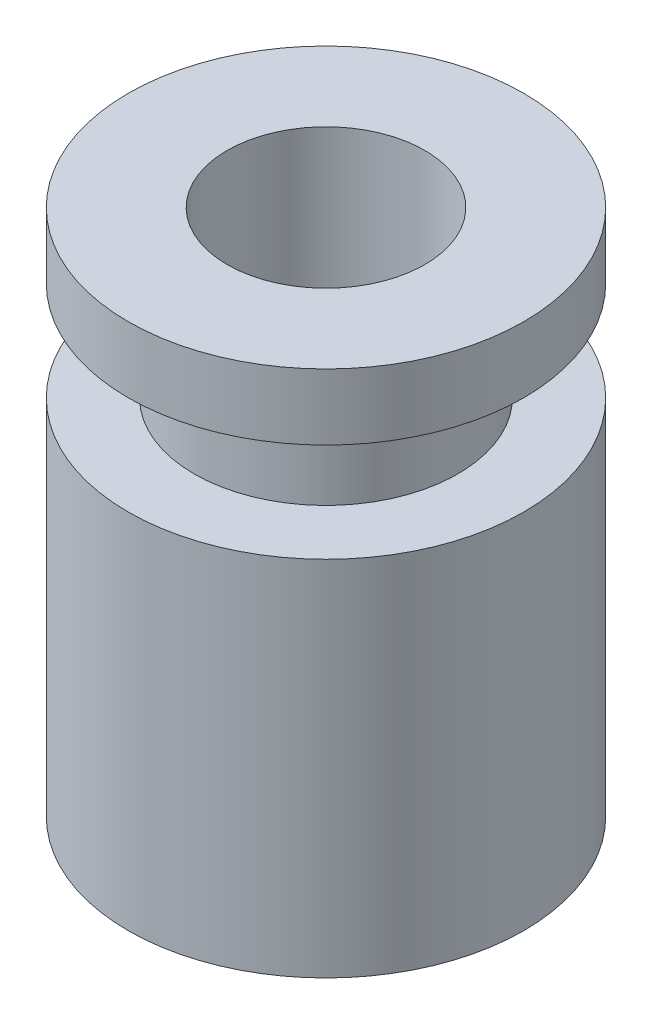
ISO-10303-21;
HEADER;
FILE_DESCRIPTION(('STEP AP214'),'2;1');
FILE_NAME('part.step','',(''),(''),'','','');
FILE_SCHEMA(('AUTOMOTIVE_DESIGN { 1 0 10303 214 1 1 1 1 }'));
ENDSEC;
DATA;
#1=APPLICATION_CONTEXT('core data for automotive mechanical design processes');
#2=APPLICATION_PROTOCOL_DEFINITION('international standard','automotive_design',2000,#1);
#3=PRODUCT_CONTEXT('',#1,'mechanical');
#4=PRODUCT('Part','Part','',(#3));
#5=PRODUCT_RELATED_PRODUCT_CATEGORY('part','',(#4));
#6=PRODUCT_DEFINITION_FORMATION('','',#4);
#7=PRODUCT_DEFINITION_CONTEXT('part definition',#1,'design');
#8=PRODUCT_DEFINITION('design','',#6,#7);
#9=PRODUCT_DEFINITION_SHAPE('','',#8);
#10=(LENGTH_UNIT() NAMED_UNIT(*) SI_UNIT(.MILLI.,.METRE.));
#11=(NAMED_UNIT(*) PLANE_ANGLE_UNIT() SI_UNIT($,.RADIAN.));
#12=(NAMED_UNIT(*) SI_UNIT($,.STERADIAN.) SOLID_ANGLE_UNIT());
#13=UNCERTAINTY_MEASURE_WITH_UNIT(LENGTH_MEASURE(1.E-05),#10,'distance_accuracy_value','');
#14=(GEOMETRIC_REPRESENTATION_CONTEXT(3) GLOBAL_UNCERTAINTY_ASSIGNED_CONTEXT((#13)) GLOBAL_UNIT_ASSIGNED_CONTEXT((#10,
#11,#12)) REPRESENTATION_CONTEXT('',''));
#15=CARTESIAN_POINT('',(0.,0.,0.));
#16=DIRECTION('',(0.,0.,1.));
#17=DIRECTION('',(1.,0.,0.));
#18=AXIS2_PLACEMENT_3D('',#15,#16,#17);
#19=CARTESIAN_POINT('',(0.,5.5,0.));
#20=DIRECTION('',(0.,1.,0.));
#21=DIRECTION('',(0.,0.,1.));
#22=AXIS2_PLACEMENT_3D('',#19,#20,#21);
#23=PLANE('',#22);
#24=CARTESIAN_POINT('',(0.,5.5,0.));
#25=DIRECTION('',(0.,1.,0.));
#26=DIRECTION('',(0.,0.,1.));
#27=AXIS2_PLACEMENT_3D('',#24,#25,#26);
#28=CIRCLE('',#27,3.);
#29=CARTESIAN_POINT('',(0.,5.5,3.));
#30=VERTEX_POINT('',#29);
#31=EDGE_CURVE('E11',#30,#30,#28,.T.);
#32=ORIENTED_EDGE('',*,*,#31,.T.);
#33=EDGE_LOOP('',(#32));
#34=FACE_BOUND('',#33,.T.);
#35=CARTESIAN_POINT('',(0.,5.5,0.));
#36=DIRECTION('',(0.,1.,0.));
#37=DIRECTION('',(0.,0.,1.));
#38=AXIS2_PLACEMENT_3D('',#35,#36,#37);
#39=CIRCLE('',#38,2.);
#40=CARTESIAN_POINT('',(0.,5.5,2.));
#41=VERTEX_POINT('',#40);
#42=EDGE_CURVE('E58',#41,#41,#39,.T.);
#43=ORIENTED_EDGE('',*,*,#42,.F.);
#44=EDGE_LOOP('',(#43));
#45=FACE_BOUND('',#44,.T.);
#46=ADVANCED_FACE('F42',(#34,#45),#23,.T.);
#47=CARTESIAN_POINT('',(0.,0.,0.));
#48=DIRECTION('',(0.,1.,0.));
#49=DIRECTION('',(0.,0.,1.));
#50=AXIS2_PLACEMENT_3D('',#47,#48,#49);
#51=PLANE('',#50);
#52=CARTESIAN_POINT('',(0.,0.,0.));
#53=DIRECTION('',(0.,1.,0.));
#54=DIRECTION('',(0.,0.,1.));
#55=AXIS2_PLACEMENT_3D('',#52,#53,#54);
#56=CIRCLE('',#55,3.);
#57=CARTESIAN_POINT('',(0.,0.,3.));
#58=VERTEX_POINT('',#57);
#59=EDGE_CURVE('E46',#58,#58,#56,.T.);
#60=ORIENTED_EDGE('',*,*,#59,.F.);
#61=EDGE_LOOP('',(#60));
#62=FACE_BOUND('',#61,.T.);
#63=CARTESIAN_POINT('',(0.,0.,0.));
#64=DIRECTION('',(0.,1.,0.));
#65=DIRECTION('',(0.,0.,1.));
#66=AXIS2_PLACEMENT_3D('',#63,#64,#65);
#67=CIRCLE('',#66,1.5);
#68=CARTESIAN_POINT('',(0.,0.,1.5));
#69=VERTEX_POINT('',#68);
#70=EDGE_CURVE('E53',#69,#69,#67,.T.);
#71=ORIENTED_EDGE('',*,*,#70,.T.);
#72=EDGE_LOOP('',(#71));
#73=FACE_BOUND('',#72,.T.);
#74=ADVANCED_FACE('F91',(#62,#73),#51,.F.);
#75=CARTESIAN_POINT('',(0.,5.5,0.));
#76=DIRECTION('',(0.,-1.,0.));
#77=DIRECTION('',(0.,0.,-1.));
#78=AXIS2_PLACEMENT_3D('',#75,#76,#77);
#79=CYLINDRICAL_SURFACE('',#78,3.);
#80=ORIENTED_EDGE('',*,*,#31,.F.);
#81=EDGE_LOOP('',(#80));
#82=FACE_BOUND('',#81,.T.);
#83=ORIENTED_EDGE('',*,*,#59,.T.);
#84=EDGE_LOOP('',(#83));
#85=FACE_BOUND('',#84,.T.);
#86=ADVANCED_FACE('F44',(#82,#85),#79,.T.);
#87=CARTESIAN_POINT('',(0.,5.5,0.));
#88=DIRECTION('',(0.,-1.,0.));
#89=DIRECTION('',(0.,0.,-1.));
#90=AXIS2_PLACEMENT_3D('',#87,#88,#89);
#91=CYLINDRICAL_SURFACE('',#90,1.5);
#92=ORIENTED_EDGE('',*,*,#70,.F.);
#93=EDGE_LOOP('',(#92));
#94=FACE_BOUND('',#93,.T.);
#95=CARTESIAN_POINT('',(0.,8.,0.));
#96=DIRECTION('',(0.,1.,0.));
#97=DIRECTION('',(0.,0.,1.));
#98=AXIS2_PLACEMENT_3D('',#95,#96,#97);
#99=CIRCLE('',#98,1.5);
#100=CARTESIAN_POINT('',(0.,8.,1.5));
#101=VERTEX_POINT('',#100);
#102=EDGE_CURVE('E67',#101,#101,#99,.T.);
#103=ORIENTED_EDGE('',*,*,#102,.T.);
#104=EDGE_LOOP('',(#103));
#105=FACE_BOUND('',#104,.T.);
#106=ADVANCED_FACE('F73',(#94,#105),#91,.F.);
#107=CARTESIAN_POINT('',(0.,7.,0.));
#108=DIRECTION('',(0.,-1.,0.));
#109=DIRECTION('',(0.,0.,-1.));
#110=AXIS2_PLACEMENT_3D('',#107,#108,#109);
#111=CYLINDRICAL_SURFACE('',#110,2.);
#112=CARTESIAN_POINT('',(0.,7.,0.));
#113=DIRECTION('',(0.,1.,0.));
#114=DIRECTION('',(0.,0.,1.));
#115=AXIS2_PLACEMENT_3D('',#112,#113,#114);
#116=CIRCLE('',#115,2.);
#117=CARTESIAN_POINT('',(0.,7.,2.));
#118=VERTEX_POINT('',#117);
#119=EDGE_CURVE('E57',#118,#118,#116,.T.);
#120=ORIENTED_EDGE('',*,*,#119,.F.);
#121=EDGE_LOOP('',(#120));
#122=FACE_BOUND('',#121,.T.);
#123=ORIENTED_EDGE('',*,*,#42,.T.);
#124=EDGE_LOOP('',(#123));
#125=FACE_BOUND('',#124,.T.);
#126=ADVANCED_FACE('F78',(#122,#125),#111,.T.);
#127=CARTESIAN_POINT('',(0.,8.,0.));
#128=DIRECTION('',(0.,1.,0.));
#129=DIRECTION('',(0.,0.,1.));
#130=AXIS2_PLACEMENT_3D('',#127,#128,#129);
#131=PLANE('',#130);
#132=CARTESIAN_POINT('',(0.,8.,0.));
#133=DIRECTION('',(0.,1.,0.));
#134=DIRECTION('',(0.,0.,1.));
#135=AXIS2_PLACEMENT_3D('',#132,#133,#134);
#136=CIRCLE('',#135,3.);
#137=CARTESIAN_POINT('',(0.,8.,3.));
#138=VERTEX_POINT('',#137);
#139=EDGE_CURVE('E61',#138,#138,#136,.T.);
#140=ORIENTED_EDGE('',*,*,#139,.T.);
#141=EDGE_LOOP('',(#140));
#142=FACE_BOUND('',#141,.T.);
#143=ORIENTED_EDGE('',*,*,#102,.F.);
#144=EDGE_LOOP('',(#143));
#145=FACE_BOUND('',#144,.T.);
#146=ADVANCED_FACE('F75',(#142,#145),#131,.T.);
#147=CARTESIAN_POINT('',(0.,7.,0.));
#148=DIRECTION('',(0.,1.,0.));
#149=DIRECTION('',(0.,0.,1.));
#150=AXIS2_PLACEMENT_3D('',#147,#148,#149);
#151=PLANE('',#150);
#152=ORIENTED_EDGE('',*,*,#119,.T.);
#153=EDGE_LOOP('',(#152));
#154=FACE_BOUND('',#153,.T.);
#155=CARTESIAN_POINT('',(0.,7.,0.));
#156=DIRECTION('',(0.,1.,0.));
#157=DIRECTION('',(0.,0.,1.));
#158=AXIS2_PLACEMENT_3D('',#155,#156,#157);
#159=CIRCLE('',#158,3.);
#160=CARTESIAN_POINT('',(0.,7.,3.));
#161=VERTEX_POINT('',#160);
#162=EDGE_CURVE('E64',#161,#161,#159,.T.);
#163=ORIENTED_EDGE('',*,*,#162,.F.);
#164=EDGE_LOOP('',(#163));
#165=FACE_BOUND('',#164,.T.);
#166=ADVANCED_FACE('F77',(#154,#165),#151,.F.);
#167=CARTESIAN_POINT('',(0.,8.,0.));
#168=DIRECTION('',(0.,-1.,0.));
#169=DIRECTION('',(0.,0.,-1.));
#170=AXIS2_PLACEMENT_3D('',#167,#168,#169);
#171=CYLINDRICAL_SURFACE('',#170,3.);
#172=ORIENTED_EDGE('',*,*,#139,.F.);
#173=EDGE_LOOP('',(#172));
#174=FACE_BOUND('',#173,.T.);
#175=ORIENTED_EDGE('',*,*,#162,.T.);
#176=EDGE_LOOP('',(#175));
#177=FACE_BOUND('',#176,.T.);
#178=ADVANCED_FACE('F85',(#174,#177),#171,.T.);
#179=CLOSED_SHELL('',(#46,#74,#86,#106,#126,#146,#166,#178));
#180=MANIFOLD_SOLID_BREP('B2',#179);
#181=ADVANCED_BREP_SHAPE_REPRESENTATION('',(#18,#180),#14);
#182=SHAPE_DEFINITION_REPRESENTATION(#9,#181);
ENDSEC;
END-ISO-10303-21;
